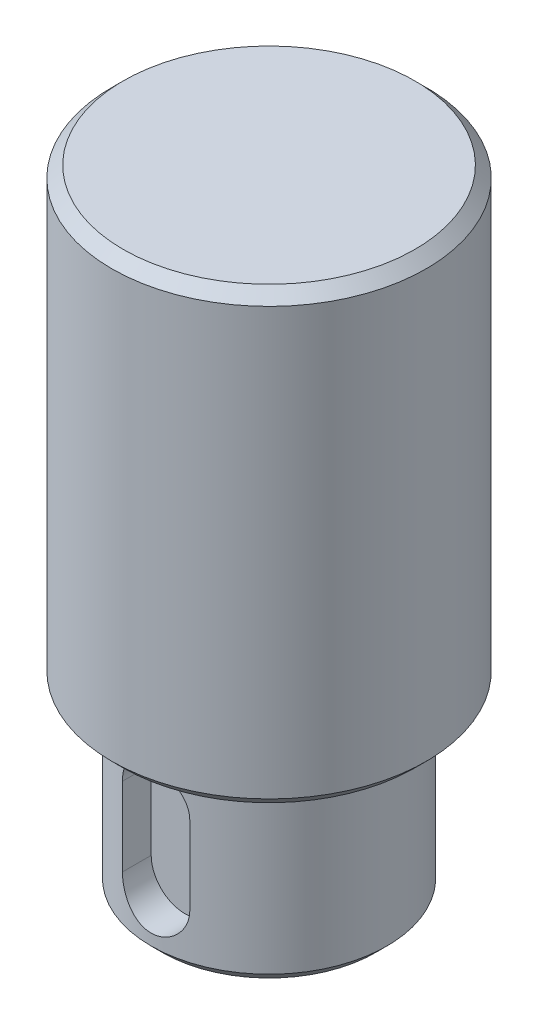
ISO-10303-21;
HEADER;
FILE_DESCRIPTION(('STEP AP214'),'2;1');
FILE_NAME('part.step','',(''),(''),'','','');
FILE_SCHEMA(('AUTOMOTIVE_DESIGN { 1 0 10303 214 1 1 1 1 }'));
ENDSEC;
DATA;
#1=APPLICATION_CONTEXT('core data for automotive mechanical design processes');
#2=APPLICATION_PROTOCOL_DEFINITION('international standard','automotive_design',2000,#1);
#3=PRODUCT_CONTEXT('',#1,'mechanical');
#4=PRODUCT('Part','Part','',(#3));
#5=PRODUCT_RELATED_PRODUCT_CATEGORY('part','',(#4));
#6=PRODUCT_DEFINITION_FORMATION('','',#4);
#7=PRODUCT_DEFINITION_CONTEXT('part definition',#1,'design');
#8=PRODUCT_DEFINITION('design','',#6,#7);
#9=PRODUCT_DEFINITION_SHAPE('','',#8);
#10=(LENGTH_UNIT() NAMED_UNIT(*) SI_UNIT(.MILLI.,.METRE.));
#11=(NAMED_UNIT(*) PLANE_ANGLE_UNIT() SI_UNIT($,.RADIAN.));
#12=(NAMED_UNIT(*) SI_UNIT($,.STERADIAN.) SOLID_ANGLE_UNIT());
#13=UNCERTAINTY_MEASURE_WITH_UNIT(LENGTH_MEASURE(1.E-05),#10,'distance_accuracy_value','');
#14=(GEOMETRIC_REPRESENTATION_CONTEXT(3) GLOBAL_UNCERTAINTY_ASSIGNED_CONTEXT((#13)) GLOBAL_UNIT_ASSIGNED_CONTEXT((#10,
#11,#12)) REPRESENTATION_CONTEXT('',''));
#15=CARTESIAN_POINT('',(0.,0.,0.));
#16=DIRECTION('',(0.,0.,1.));
#17=DIRECTION('',(1.,0.,0.));
#18=AXIS2_PLACEMENT_3D('',#15,#16,#17);
#19=CARTESIAN_POINT('',(0.,16.,0.));
#20=DIRECTION('',(0.,-1.,0.));
#21=DIRECTION('',(0.,0.,-1.));
#22=AXIS2_PLACEMENT_3D('',#19,#20,#21);
#23=CYLINDRICAL_SURFACE('',#22,10.5);
#24=CARTESIAN_POINT('',(0.,16.,0.));
#25=DIRECTION('',(0.,1.,0.));
#26=DIRECTION('',(0.,0.,1.));
#27=AXIS2_PLACEMENT_3D('',#24,#25,#26);
#28=CIRCLE('',#27,10.5);
#29=CARTESIAN_POINT('',(0.,16.,10.5));
#30=VERTEX_POINT('',#29);
#31=EDGE_CURVE('E88',#30,#30,#28,.T.);
#32=ORIENTED_EDGE('',*,*,#31,.F.);
#33=EDGE_LOOP('',(#32));
#34=FACE_BOUND('',#33,.T.);
#35=CARTESIAN_POINT('',(0.,1.00000000000002,0.));
#36=DIRECTION('',(0.,1.,0.));
#37=DIRECTION('',(0.,0.,1.));
#38=AXIS2_PLACEMENT_3D('',#35,#36,#37);
#39=CIRCLE('',#38,10.5);
#40=CARTESIAN_POINT('',(0.,1.00000000000002,10.5));
#41=VERTEX_POINT('',#40);
#42=EDGE_CURVE('E125',#41,#41,#39,.T.);
#43=ORIENTED_EDGE('',*,*,#42,.T.);
#44=EDGE_LOOP('',(#43));
#45=FACE_BOUND('',#44,.T.);
#46=CARTESIAN_POINT('',(-3.,5.00000000000001,10.0623058987491));
#47=CARTESIAN_POINT('',(-3.00001007568609,4.91747229630119,10.0622950757826));
#48=CARTESIAN_POINT('',(-2.99659476950194,4.83495090509575,10.0633209492765));
#49=CARTESIAN_POINT('',(-2.98299174091271,4.67053400797023,10.0673657051101));
#50=CARTESIAN_POINT('',(-2.97280542284925,4.5886383758265,10.0703841741745));
#51=CARTESIAN_POINT('',(-2.9457706127874,4.42624348806317,10.0783244137549));
#52=CARTESIAN_POINT('',(-2.92893790813486,4.34574139193488,10.0832416734154));
#53=CARTESIAN_POINT('',(-2.88877287742495,4.18652524808415,10.0948216930228));
#54=CARTESIAN_POINT('',(-2.86544040637484,4.10781124029163,10.1014844919079));
#55=CARTESIAN_POINT('',(-2.78597041579061,3.87521176775097,10.1238054079594));
#56=CARTESIAN_POINT('',(-2.72032782892651,3.72467569977241,10.1418061988904));
#57=CARTESIAN_POINT('',(-2.56574501584104,3.43676235344665,10.182008252327));
#58=CARTESIAN_POINT('',(-2.47679533602728,3.29939044556493,10.2042112182601));
#59=CARTESIAN_POINT('',(-2.27539135789862,3.03772294634567,10.2510259436634));
#60=CARTESIAN_POINT('',(-2.16238978249344,2.91385623499998,10.2756850752583));
#61=CARTESIAN_POINT('',(-1.9172628691588,2.6865489829701,10.3242283770173));
#62=CARTESIAN_POINT('',(-1.78513436609075,2.58311182969613,10.3481124181164));
#63=CARTESIAN_POINT('',(-1.50246598390706,2.3977554589388,10.3929504684919));
#64=CARTESIAN_POINT('',(-1.35162946479443,2.31627207145993,10.4138417446624));
#65=CARTESIAN_POINT('',(-1.03770539451938,2.17999474667545,10.4497887869605));
#66=CARTESIAN_POINT('',(-0.874620783947977,2.12519442664181,10.4648459484623));
#67=CARTESIAN_POINT('',(-0.545339601768409,2.04524876477139,10.4870926710975));
#68=CARTESIAN_POINT('',(-0.379335231597605,2.0193670250492,10.4944772490717));
#69=CARTESIAN_POINT('',(-0.0451837263244565,1.99566984572765,10.5012314472706));
#70=CARTESIAN_POINT('',(0.12296303970599,1.99784963554996,10.5006024298403));
#71=CARTESIAN_POINT('',(0.451471135783351,2.02970964338866,10.4915400782785));
#72=CARTESIAN_POINT('',(0.611916987228,2.05859271017758,10.4833329755424));
#73=CARTESIAN_POINT('',(0.925579926475177,2.14174322705186,10.46030814162));
#74=CARTESIAN_POINT('',(1.07879664890102,2.1960119586769,10.4454900766955));
#75=CARTESIAN_POINT('',(1.37561195561501,2.32896460204327,10.4105853337597));
#76=CARTESIAN_POINT('',(1.51908688299447,2.40790929437626,10.3904427536476));
#77=CARTESIAN_POINT('',(1.79101296478513,2.58776867337807,10.347041158754));
#78=CARTESIAN_POINT('',(1.91946106171334,2.68868781924021,10.3237815118066));
#79=CARTESIAN_POINT('',(2.16243643727296,2.91379639409231,10.27568771158));
#80=CARTESIAN_POINT('',(2.27631917605386,3.03867663036598,10.2508269435583));
#81=CARTESIAN_POINT('',(2.48172106578324,3.30604594440609,10.203049292707));
#82=CARTESIAN_POINT('',(2.57323387416197,3.44853999903395,10.1801329623854));
#83=CARTESIAN_POINT('',(2.73189866110141,3.74868083927728,10.138714684744));
#84=CARTESIAN_POINT('',(2.79883690457352,3.90644615553258,10.1202519258084));
#85=CARTESIAN_POINT('',(2.9049345962302,4.23156809618218,10.0903143825329));
#86=CARTESIAN_POINT('',(2.94413614726055,4.39890976496776,10.0788290106487));
#87=CARTESIAN_POINT('',(2.97918032494555,4.63981919271016,10.0684940235043));
#88=CARTESIAN_POINT('',(2.98698754163258,4.71166903223153,10.0661781041413));
#89=CARTESIAN_POINT('',(2.9973923115653,4.85566733786495,10.0630841226066));
#90=CARTESIAN_POINT('',(2.99999781052918,4.92781517956389,10.0623037149394));
#91=CARTESIAN_POINT('',(3.,5.00000000000001,10.0623058987491));
#92=B_SPLINE_CURVE_WITH_KNOTS('',3,(#46,#47,#48,#49,#50,#51,#52,#53,#54,#55,#56,#57,#58,#59,#60,
#61,#62,#63,#64,#65,#66,#67,#68,#69,#70,#71,#72,#73,#74,#75,#76,#77,#78,#79,#80,#81,#82,#83,#84,
#85,#86,#87,#88,#89,#90,#91),.UNSPECIFIED.,.F.,.F.,(4,2,2,2,2,2,2,2,2,2,2,2,2,2,2,2,2,2,2,2,2,2,
4),(0.,0.247495307282728,0.494939298814788,0.74179903188751,0.988664272194235,1.48181375772418,
1.97516358014056,2.48124355983974,2.98740738197787,3.50298208529029,4.01843339980056,
4.5204365620078,5.02235438268819,5.50975645401013,5.99718313341432,6.48994590365467,
6.98280876173824,7.49292100869899,8.0031777209948,8.51777272251166,9.03158491015393,
9.24834631715141,9.46477636305267),.UNSPECIFIED.);
#93=CARTESIAN_POINT('',(-3.,5.00000000000001,10.0623058987491));
#94=VERTEX_POINT('',#93);
#95=CARTESIAN_POINT('',(3.,5.00000000000001,10.0623058987491));
#96=VERTEX_POINT('',#95);
#97=EDGE_CURVE('E11',#94,#96,#92,.T.);
#98=ORIENTED_EDGE('',*,*,#97,.F.);
#99=DIRECTION('',(0.,-1.,0.));
#100=VECTOR('',#99,1.);
#101=CARTESIAN_POINT('',(-3.,16.,10.0623058987491));
#102=LINE('',#101,#100);
#103=CARTESIAN_POINT('',(-3.,12.,10.0623058987491));
#104=VERTEX_POINT('',#103);
#105=EDGE_CURVE('E131',#104,#94,#102,.T.);
#106=ORIENTED_EDGE('',*,*,#105,.F.);
#107=CARTESIAN_POINT('',(3.,12.,10.0623058987491));
#108=CARTESIAN_POINT('',(3.00001007568609,12.0825277036988,10.0622950757826));
#109=CARTESIAN_POINT('',(2.99659476950194,12.1650490949043,10.0633209492765));
#110=CARTESIAN_POINT('',(2.98299174091272,12.3294659920298,10.0673657051101));
#111=CARTESIAN_POINT('',(2.97280542284925,12.4113616241735,10.0703841741745));
#112=CARTESIAN_POINT('',(2.9457706127874,12.5737565119368,10.0783244137549));
#113=CARTESIAN_POINT('',(2.92893790813486,12.6542586080651,10.0832416734154));
#114=CARTESIAN_POINT('',(2.88877287742495,12.8134747519159,10.0948216930228));
#115=CARTESIAN_POINT('',(2.86544040637484,12.8921887597084,10.1014844919079));
#116=CARTESIAN_POINT('',(2.78597041579061,13.124788232249,10.1238054079594));
#117=CARTESIAN_POINT('',(2.72032782892651,13.2753243002276,10.1418061988904));
#118=CARTESIAN_POINT('',(2.56574501584104,13.5632376465534,10.182008252327));
#119=CARTESIAN_POINT('',(2.47679533602728,13.7006095544351,10.2042112182601));
#120=CARTESIAN_POINT('',(2.27539135789862,13.9622770536543,10.2510259436634));
#121=CARTESIAN_POINT('',(2.16238978249344,14.086143765,10.2756850752583));
#122=CARTESIAN_POINT('',(1.9172628691588,14.3134510170299,10.3242283770173));
#123=CARTESIAN_POINT('',(1.78513436609075,14.4168881703039,10.3481124181164));
#124=CARTESIAN_POINT('',(1.50246598390706,14.6022445410612,10.3929504684919));
#125=CARTESIAN_POINT('',(1.35162946479442,14.6837279285401,10.4138417446624));
#126=CARTESIAN_POINT('',(1.03770539451938,14.8200052533246,10.4497887869605));
#127=CARTESIAN_POINT('',(0.874620783947976,14.8748055733582,10.4648459484623));
#128=CARTESIAN_POINT('',(0.545339601768408,14.9547512352286,10.4870926710975));
#129=CARTESIAN_POINT('',(0.379335231597604,14.9806329749508,10.4944772490717));
#130=CARTESIAN_POINT('',(0.0451837263244551,15.0043301542724,10.5012314472706));
#131=CARTESIAN_POINT('',(-0.122963039705991,15.0021503644501,10.5006024298403));
#132=CARTESIAN_POINT('',(-0.451471135783353,14.9702903566114,10.4915400782785));
#133=CARTESIAN_POINT('',(-0.611916987228002,14.9414072898224,10.4833329755424));
#134=CARTESIAN_POINT('',(-0.925579926475179,14.8582567729482,10.46030814162));
#135=CARTESIAN_POINT('',(-1.07879664890103,14.8039880413231,10.4454900766955));
#136=CARTESIAN_POINT('',(-1.37561195561501,14.6710353979567,10.4105853337597));
#137=CARTESIAN_POINT('',(-1.51908688299447,14.5920907056238,10.3904427536476));
#138=CARTESIAN_POINT('',(-1.79101296478513,14.4122313266219,10.347041158754));
#139=CARTESIAN_POINT('',(-1.91946106171334,14.3113121807598,10.3237815118066));
#140=CARTESIAN_POINT('',(-2.16243643727296,14.0862036059077,10.27568771158));
#141=CARTESIAN_POINT('',(-2.27631917605386,13.961323369634,10.2508269435583));
#142=CARTESIAN_POINT('',(-2.48172106578324,13.6939540555939,10.203049292707));
#143=CARTESIAN_POINT('',(-2.57323387416197,13.5514600009661,10.1801329623854));
#144=CARTESIAN_POINT('',(-2.73189866110141,13.2513191607227,10.138714684744));
#145=CARTESIAN_POINT('',(-2.79883690457352,13.0935538444674,10.1202519258084));
#146=CARTESIAN_POINT('',(-2.9049345962302,12.7684319038178,10.0903143825329));
#147=CARTESIAN_POINT('',(-2.94413614726055,12.6010902350323,10.0788290106487));
#148=CARTESIAN_POINT('',(-2.97918032494555,12.3601808072899,10.0684940235043));
#149=CARTESIAN_POINT('',(-2.98698754163258,12.2883309677685,10.0661781041413));
#150=CARTESIAN_POINT('',(-2.9973923115653,12.1443326621351,10.0630841226066));
#151=CARTESIAN_POINT('',(-2.99999781052918,12.0721848204361,10.0623037149394));
#152=CARTESIAN_POINT('',(-3.,12.,10.0623058987491));
#153=B_SPLINE_CURVE_WITH_KNOTS('',3,(#107,#108,#109,#110,#111,#112,#113,#114,#115,#116,#117,
#118,#119,#120,#121,#122,#123,#124,#125,#126,#127,#128,#129,#130,#131,#132,#133,#134,#135,#136,
#137,#138,#139,#140,#141,#142,#143,#144,#145,#146,#147,#148,#149,#150,#151,#152),.UNSPECIFIED.,
.F.,.F.,(4,2,2,2,2,2,2,2,2,2,2,2,2,2,2,2,2,2,2,2,2,2,4),(0.,0.247495307282726,0.494939298814787,
0.74179903188751,0.988664272194234,1.48181375772418,1.97516358014056,2.48124355983974,
2.98740738197787,3.5029820852903,4.01843339980056,4.5204365620078,5.02235438268819,
5.50975645401014,5.99718313341432,6.48994590365467,6.98280876173824,7.49292100869899,
8.0031777209948,8.51777272251166,9.03158491015394,9.24834631715141,9.46477636305267),.UNSPECIFIED.);
#154=CARTESIAN_POINT('',(3.,12.,10.0623058987491));
#155=VERTEX_POINT('',#154);
#156=EDGE_CURVE('E133',#155,#104,#153,.T.);
#157=ORIENTED_EDGE('',*,*,#156,.F.);
#158=DIRECTION('',(0.,-1.,0.));
#159=VECTOR('',#158,1.);
#160=CARTESIAN_POINT('',(3.,16.,10.0623058987491));
#161=LINE('',#160,#159);
#162=EDGE_CURVE('E51',#96,#155,#161,.F.);
#163=ORIENTED_EDGE('',*,*,#162,.F.);
#164=EDGE_LOOP('',(#98,#106,#157,#163));
#165=FACE_BOUND('',#164,.T.);
#166=ADVANCED_FACE('F36',(#34,#45,#165),#23,.T.);
#167=CARTESIAN_POINT('',(0.,56.,0.));
#168=DIRECTION('',(0.,-1.,0.));
#169=DIRECTION('',(0.,0.,-1.));
#170=AXIS2_PLACEMENT_3D('',#167,#168,#169);
#171=CYLINDRICAL_SURFACE('',#170,14.);
#172=CARTESIAN_POINT('',(0.,55.,0.));
#173=DIRECTION('',(0.,1.,0.));
#174=DIRECTION('',(0.,0.,1.));
#175=AXIS2_PLACEMENT_3D('',#172,#173,#174);
#176=CIRCLE('',#175,14.);
#177=CARTESIAN_POINT('',(0.,55.,14.));
#178=VERTEX_POINT('',#177);
#179=EDGE_CURVE('E119',#178,#178,#176,.F.);
#180=ORIENTED_EDGE('',*,*,#179,.T.);
#181=EDGE_LOOP('',(#180));
#182=FACE_BOUND('',#181,.T.);
#183=CARTESIAN_POINT('',(0.,17.,0.));
#184=DIRECTION('',(0.,1.,0.));
#185=DIRECTION('',(0.,0.,1.));
#186=AXIS2_PLACEMENT_3D('',#183,#184,#185);
#187=CIRCLE('',#186,14.);
#188=CARTESIAN_POINT('',(0.,17.,14.));
#189=VERTEX_POINT('',#188);
#190=EDGE_CURVE('E116',#189,#189,#187,.T.);
#191=ORIENTED_EDGE('',*,*,#190,.T.);
#192=EDGE_LOOP('',(#191));
#193=FACE_BOUND('',#192,.T.);
#194=ADVANCED_FACE('F158',(#182,#193),#171,.T.);
#195=CARTESIAN_POINT('',(0.,56.,0.));
#196=DIRECTION('',(0.,1.,0.));
#197=DIRECTION('',(0.,0.,1.));
#198=AXIS2_PLACEMENT_3D('',#195,#196,#197);
#199=PLANE('',#198);
#200=CARTESIAN_POINT('',(0.,56.,0.));
#201=DIRECTION('',(0.,1.,0.));
#202=DIRECTION('',(0.,0.,1.));
#203=AXIS2_PLACEMENT_3D('',#200,#201,#202);
#204=CIRCLE('',#203,13.);
#205=CARTESIAN_POINT('',(0.,56.,13.));
#206=VERTEX_POINT('',#205);
#207=EDGE_CURVE('E113',#206,#206,#204,.T.);
#208=ORIENTED_EDGE('',*,*,#207,.T.);
#209=EDGE_LOOP('',(#208));
#210=FACE_BOUND('',#209,.T.);
#211=ADVANCED_FACE('F163',(#210),#199,.T.);
#212=CARTESIAN_POINT('',(0.,16.,0.));
#213=DIRECTION('',(0.,1.,0.));
#214=DIRECTION('',(0.,0.,1.));
#215=AXIS2_PLACEMENT_3D('',#212,#213,#214);
#216=PLANE('',#215);
#217=CARTESIAN_POINT('',(0.,16.,0.));
#218=DIRECTION('',(0.,1.,0.));
#219=DIRECTION('',(0.,0.,1.));
#220=AXIS2_PLACEMENT_3D('',#217,#218,#219);
#221=CIRCLE('',#220,13.);
#222=CARTESIAN_POINT('',(0.,16.,13.));
#223=VERTEX_POINT('',#222);
#224=EDGE_CURVE('E122',#223,#223,#221,.F.);
#225=ORIENTED_EDGE('',*,*,#224,.T.);
#226=EDGE_LOOP('',(#225));
#227=FACE_BOUND('',#226,.T.);
#228=ORIENTED_EDGE('',*,*,#31,.T.);
#229=EDGE_LOOP('',(#228));
#230=FACE_BOUND('',#229,.T.);
#231=ADVANCED_FACE('F237',(#227,#230),#216,.F.);
#232=CARTESIAN_POINT('',(0.,0.,0.));
#233=DIRECTION('',(0.,1.,0.));
#234=DIRECTION('',(0.,0.,1.));
#235=AXIS2_PLACEMENT_3D('',#232,#233,#234);
#236=PLANE('',#235);
#237=CARTESIAN_POINT('',(0.,0.,0.));
#238=DIRECTION('',(0.,1.,0.));
#239=DIRECTION('',(0.,0.,1.));
#240=AXIS2_PLACEMENT_3D('',#237,#238,#239);
#241=CIRCLE('',#240,9.49999999999998);
#242=CARTESIAN_POINT('',(0.,0.,9.49999999999998));
#243=VERTEX_POINT('',#242);
#244=EDGE_CURVE('E128',#243,#243,#241,.F.);
#245=ORIENTED_EDGE('',*,*,#244,.T.);
#246=EDGE_LOOP('',(#245));
#247=FACE_BOUND('',#246,.T.);
#248=ADVANCED_FACE('F226',(#247),#236,.F.);
#249=CARTESIAN_POINT('',(0.,56.,0.));
#250=DIRECTION('',(0.,-1.,0.));
#251=DIRECTION('',(0.,0.,-1.));
#252=AXIS2_PLACEMENT_3D('',#249,#250,#251);
#253=CONICAL_SURFACE('',#252,13.,0.785398163397446);
#254=ORIENTED_EDGE('',*,*,#179,.F.);
#255=EDGE_LOOP('',(#254));
#256=FACE_BOUND('',#255,.T.);
#257=ORIENTED_EDGE('',*,*,#207,.F.);
#258=EDGE_LOOP('',(#257));
#259=FACE_BOUND('',#258,.T.);
#260=ADVANCED_FACE('F217',(#256,#259),#253,.T.);
#261=CARTESIAN_POINT('',(0.,17.,0.));
#262=DIRECTION('',(0.,1.,0.));
#263=DIRECTION('',(0.,0.,1.));
#264=AXIS2_PLACEMENT_3D('',#261,#262,#263);
#265=CONICAL_SURFACE('',#264,14.,0.785398163397449);
#266=ORIENTED_EDGE('',*,*,#224,.F.);
#267=EDGE_LOOP('',(#266));
#268=FACE_BOUND('',#267,.T.);
#269=ORIENTED_EDGE('',*,*,#190,.F.);
#270=EDGE_LOOP('',(#269));
#271=FACE_BOUND('',#270,.T.);
#272=ADVANCED_FACE('F155',(#268,#271),#265,.T.);
#273=CARTESIAN_POINT('',(0.,1.00000000000002,0.));
#274=DIRECTION('',(0.,1.,0.));
#275=DIRECTION('',(0.,0.,1.));
#276=AXIS2_PLACEMENT_3D('',#273,#274,#275);
#277=CONICAL_SURFACE('',#276,10.5,0.78539816339745);
#278=ORIENTED_EDGE('',*,*,#244,.F.);
#279=EDGE_LOOP('',(#278));
#280=FACE_BOUND('',#279,.T.);
#281=ORIENTED_EDGE('',*,*,#42,.F.);
#282=EDGE_LOOP('',(#281));
#283=FACE_BOUND('',#282,.T.);
#284=ADVANCED_FACE('F39',(#280,#283),#277,.T.);
#285=CARTESIAN_POINT('',(0.,5.00000000000001,23.5));
#286=DIRECTION('',(0.,0.,-1.));
#287=DIRECTION('',(-1.,0.,0.));
#288=AXIS2_PLACEMENT_3D('',#285,#286,#287);
#289=CYLINDRICAL_SURFACE('',#288,3.);
#290=ORIENTED_EDGE('',*,*,#97,.T.);
#291=DIRECTION('',(0.,0.,-1.));
#292=VECTOR('',#291,1.);
#293=CARTESIAN_POINT('',(3.,5.00000000000001,23.5));
#294=LINE('',#293,#292);
#295=CARTESIAN_POINT('',(3.,5.00000000000001,7.5));
#296=VERTEX_POINT('',#295);
#297=EDGE_CURVE('E81',#96,#296,#294,.T.);
#298=ORIENTED_EDGE('',*,*,#297,.T.);
#299=CARTESIAN_POINT('',(0.,5.00000000000001,7.5));
#300=DIRECTION('',(0.,0.,1.));
#301=DIRECTION('',(1.,0.,0.));
#302=AXIS2_PLACEMENT_3D('',#299,#300,#301);
#303=CIRCLE('',#302,3.);
#304=CARTESIAN_POINT('',(-3.,5.00000000000001,7.5));
#305=VERTEX_POINT('',#304);
#306=EDGE_CURVE('E85',#305,#296,#303,.T.);
#307=ORIENTED_EDGE('',*,*,#306,.F.);
#308=DIRECTION('',(0.,0.,-1.));
#309=VECTOR('',#308,1.);
#310=CARTESIAN_POINT('',(-3.,5.00000000000001,23.5));
#311=LINE('',#310,#309);
#312=EDGE_CURVE('E107',#94,#305,#311,.T.);
#313=ORIENTED_EDGE('',*,*,#312,.F.);
#314=EDGE_LOOP('',(#290,#298,#307,#313));
#315=FACE_BOUND('',#314,.T.);
#316=ADVANCED_FACE('F83',(#315),#289,.F.);
#317=CARTESIAN_POINT('',(3.,5.00000000000001,23.5));
#318=DIRECTION('',(-1.,0.,0.));
#319=DIRECTION('',(0.,0.,1.));
#320=AXIS2_PLACEMENT_3D('',#317,#318,#319);
#321=PLANE('',#320);
#322=ORIENTED_EDGE('',*,*,#162,.T.);
#323=DIRECTION('',(0.,0.,-1.));
#324=VECTOR('',#323,1.);
#325=CARTESIAN_POINT('',(3.,12.,23.5));
#326=LINE('',#325,#324);
#327=CARTESIAN_POINT('',(3.,12.,7.5));
#328=VERTEX_POINT('',#327);
#329=EDGE_CURVE('E89',#155,#328,#326,.T.);
#330=ORIENTED_EDGE('',*,*,#329,.T.);
#331=DIRECTION('',(0.,1.,0.));
#332=VECTOR('',#331,1.);
#333=CARTESIAN_POINT('',(3.,5.00000000000001,7.5));
#334=LINE('',#333,#332);
#335=EDGE_CURVE('E92',#296,#328,#334,.T.);
#336=ORIENTED_EDGE('',*,*,#335,.F.);
#337=ORIENTED_EDGE('',*,*,#297,.F.);
#338=EDGE_LOOP('',(#322,#330,#336,#337));
#339=FACE_BOUND('',#338,.T.);
#340=ADVANCED_FACE('F93',(#339),#321,.T.);
#341=CARTESIAN_POINT('',(0.,12.,23.5));
#342=DIRECTION('',(0.,0.,-1.));
#343=DIRECTION('',(-1.,0.,0.));
#344=AXIS2_PLACEMENT_3D('',#341,#342,#343);
#345=CYLINDRICAL_SURFACE('',#344,3.);
#346=ORIENTED_EDGE('',*,*,#156,.T.);
#347=DIRECTION('',(0.,0.,-1.));
#348=VECTOR('',#347,1.);
#349=CARTESIAN_POINT('',(-3.,12.,23.5));
#350=LINE('',#349,#348);
#351=CARTESIAN_POINT('',(-3.,12.,7.5));
#352=VERTEX_POINT('',#351);
#353=EDGE_CURVE('E58',#104,#352,#350,.T.);
#354=ORIENTED_EDGE('',*,*,#353,.T.);
#355=CARTESIAN_POINT('',(0.,12.,7.5));
#356=DIRECTION('',(0.,0.,1.));
#357=DIRECTION('',(1.,0.,0.));
#358=AXIS2_PLACEMENT_3D('',#355,#356,#357);
#359=CIRCLE('',#358,3.);
#360=EDGE_CURVE('E98',#328,#352,#359,.T.);
#361=ORIENTED_EDGE('',*,*,#360,.F.);
#362=ORIENTED_EDGE('',*,*,#329,.F.);
#363=EDGE_LOOP('',(#346,#354,#361,#362));
#364=FACE_BOUND('',#363,.T.);
#365=ADVANCED_FACE('F141',(#364),#345,.F.);
#366=CARTESIAN_POINT('',(-3.,5.00000000000001,23.5));
#367=DIRECTION('',(1.,0.,0.));
#368=DIRECTION('',(0.,0.,-1.));
#369=AXIS2_PLACEMENT_3D('',#366,#367,#368);
#370=PLANE('',#369);
#371=ORIENTED_EDGE('',*,*,#105,.T.);
#372=ORIENTED_EDGE('',*,*,#312,.T.);
#373=DIRECTION('',(0.,-1.,0.));
#374=VECTOR('',#373,1.);
#375=CARTESIAN_POINT('',(-3.,5.00000000000001,7.5));
#376=LINE('',#375,#374);
#377=EDGE_CURVE('E102',#352,#305,#376,.T.);
#378=ORIENTED_EDGE('',*,*,#377,.F.);
#379=ORIENTED_EDGE('',*,*,#353,.F.);
#380=EDGE_LOOP('',(#371,#372,#378,#379));
#381=FACE_BOUND('',#380,.T.);
#382=ADVANCED_FACE('F146',(#381),#370,.T.);
#383=CARTESIAN_POINT('',(0.,5.00000000000001,7.5));
#384=DIRECTION('',(0.,0.,1.));
#385=DIRECTION('',(1.,0.,0.));
#386=AXIS2_PLACEMENT_3D('',#383,#384,#385);
#387=PLANE('',#386);
#388=ORIENTED_EDGE('',*,*,#306,.T.);
#389=ORIENTED_EDGE('',*,*,#335,.T.);
#390=ORIENTED_EDGE('',*,*,#360,.T.);
#391=ORIENTED_EDGE('',*,*,#377,.T.);
#392=EDGE_LOOP('',(#388,#389,#390,#391));
#393=FACE_BOUND('',#392,.T.);
#394=ADVANCED_FACE('F101',(#393),#387,.T.);
#395=CLOSED_SHELL('',(#166,#194,#211,#231,#248,#260,#272,#284,#316,#340,#365,#382,#394));
#396=MANIFOLD_SOLID_BREP('B2',#395);
#397=ADVANCED_BREP_SHAPE_REPRESENTATION('',(#18,#396),#14);
#398=SHAPE_DEFINITION_REPRESENTATION(#9,#397);
ENDSEC;
END-ISO-10303-21;
